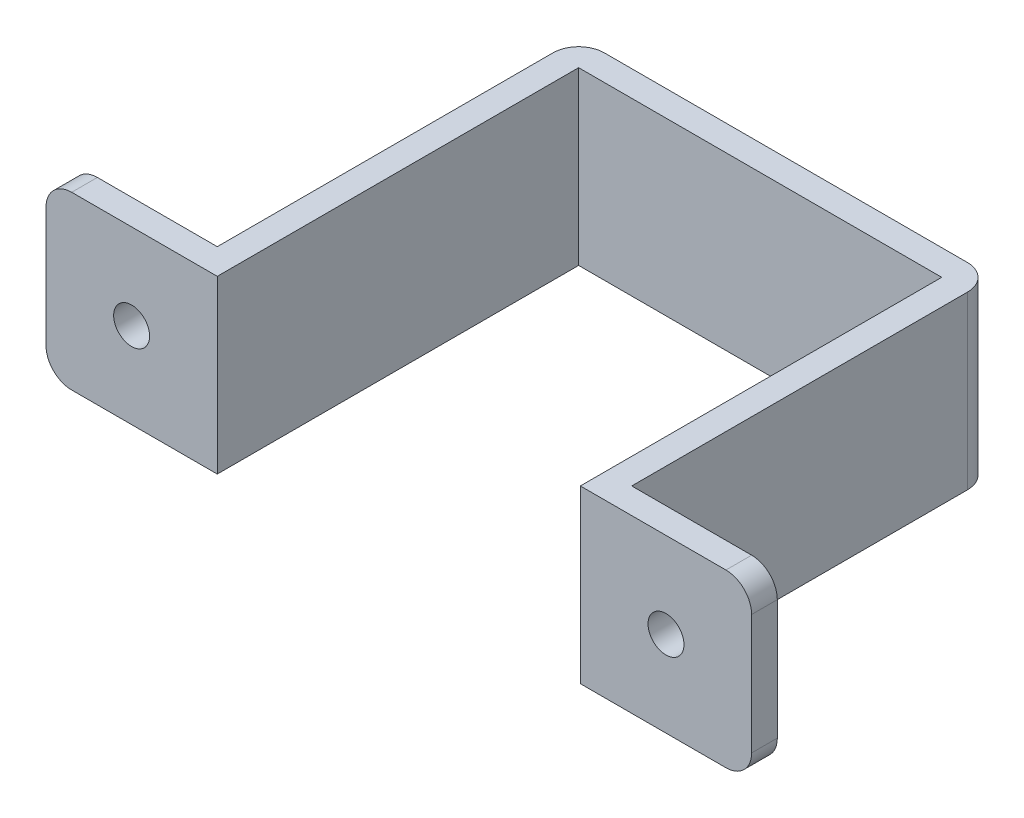
ISO-10303-21;
HEADER;
FILE_DESCRIPTION(('STEP AP214'),'2;1');
FILE_NAME('part.step','',(''),(''),'','','');
FILE_SCHEMA(('AUTOMOTIVE_DESIGN { 1 0 10303 214 1 1 1 1 }'));
ENDSEC;
DATA;
#1=APPLICATION_CONTEXT('core data for automotive mechanical design processes');
#2=APPLICATION_PROTOCOL_DEFINITION('international standard','automotive_design',2000,#1);
#3=PRODUCT_CONTEXT('',#1,'mechanical');
#4=PRODUCT('Part','Part','',(#3));
#5=PRODUCT_RELATED_PRODUCT_CATEGORY('part','',(#4));
#6=PRODUCT_DEFINITION_FORMATION('','',#4);
#7=PRODUCT_DEFINITION_CONTEXT('part definition',#1,'design');
#8=PRODUCT_DEFINITION('design','',#6,#7);
#9=PRODUCT_DEFINITION_SHAPE('','',#8);
#10=(LENGTH_UNIT() NAMED_UNIT(*) SI_UNIT(.MILLI.,.METRE.));
#11=(NAMED_UNIT(*) PLANE_ANGLE_UNIT() SI_UNIT($,.RADIAN.));
#12=(NAMED_UNIT(*) SI_UNIT($,.STERADIAN.) SOLID_ANGLE_UNIT());
#13=UNCERTAINTY_MEASURE_WITH_UNIT(LENGTH_MEASURE(1.E-05),#10,'distance_accuracy_value','');
#14=(GEOMETRIC_REPRESENTATION_CONTEXT(3) GLOBAL_UNCERTAINTY_ASSIGNED_CONTEXT((#13)) GLOBAL_UNIT_ASSIGNED_CONTEXT((#10,
#11,#12)) REPRESENTATION_CONTEXT('',''));
#15=CARTESIAN_POINT('',(0.,0.,0.));
#16=DIRECTION('',(0.,0.,1.));
#17=DIRECTION('',(1.,0.,0.));
#18=AXIS2_PLACEMENT_3D('',#15,#16,#17);
#19=CARTESIAN_POINT('',(-24.2,20.,-45.2));
#20=DIRECTION('',(1.,0.,0.));
#21=DIRECTION('',(0.,0.,-1.));
#22=AXIS2_PLACEMENT_3D('',#19,#20,#21);
#23=PLANE('',#22);
#24=DIRECTION('',(0.,0.,1.));
#25=VECTOR('',#24,1.);
#26=CARTESIAN_POINT('',(-24.2,20.,-45.2));
#27=LINE('',#26,#25);
#28=CARTESIAN_POINT('',(-24.2,20.,-42.2));
#29=VERTEX_POINT('',#28);
#30=CARTESIAN_POINT('',(-24.2,20.,-3.));
#31=VERTEX_POINT('',#30);
#32=EDGE_CURVE('E169',#29,#31,#27,.T.);
#33=ORIENTED_EDGE('',*,*,#32,.F.);
#34=DIRECTION('',(0.,-1.,0.));
#35=VECTOR('',#34,1.);
#36=CARTESIAN_POINT('',(-24.2,0.,-42.2));
#37=LINE('',#36,#35);
#38=CARTESIAN_POINT('',(-24.2,0.,-42.2));
#39=VERTEX_POINT('',#38);
#40=EDGE_CURVE('E197',#29,#39,#37,.T.);
#41=ORIENTED_EDGE('',*,*,#40,.T.);
#42=DIRECTION('',(0.,0.,1.));
#43=VECTOR('',#42,1.);
#44=CARTESIAN_POINT('',(-24.2,0.,-45.2));
#45=LINE('',#44,#43);
#46=CARTESIAN_POINT('',(-24.2,0.,-3.));
#47=VERTEX_POINT('',#46);
#48=EDGE_CURVE('E195',#39,#47,#45,.T.);
#49=ORIENTED_EDGE('',*,*,#48,.T.);
#50=DIRECTION('',(0.,-1.,0.));
#51=VECTOR('',#50,1.);
#52=CARTESIAN_POINT('',(-24.2,20.,-3.));
#53=LINE('',#52,#51);
#54=EDGE_CURVE('E188',#31,#47,#53,.T.);
#55=ORIENTED_EDGE('',*,*,#54,.F.);
#56=EDGE_LOOP('',(#33,#41,#49,#55));
#57=FACE_BOUND('',#56,.T.);
#58=ADVANCED_FACE('F43',(#57),#23,.F.);
#59=CARTESIAN_POINT('',(-24.2,20.,-3.));
#60=DIRECTION('',(0.,0.,1.));
#61=DIRECTION('',(1.,0.,0.));
#62=AXIS2_PLACEMENT_3D('',#59,#60,#61);
#63=PLANE('',#62);
#64=CARTESIAN_POINT('',(-31.2,10.,-3.));
#65=DIRECTION('',(0.,0.,-1.));
#66=DIRECTION('',(-1.,0.,0.));
#67=AXIS2_PLACEMENT_3D('',#64,#65,#66);
#68=CIRCLE('',#67,2.1);
#69=CARTESIAN_POINT('',(-33.3,10.,-3.));
#70=VERTEX_POINT('',#69);
#71=EDGE_CURVE('E543',#70,#70,#68,.T.);
#72=ORIENTED_EDGE('',*,*,#71,.F.);
#73=EDGE_LOOP('',(#72));
#74=FACE_BOUND('',#73,.T.);
#75=DIRECTION('',(-1.,0.,0.));
#76=VECTOR('',#75,1.);
#77=CARTESIAN_POINT('',(-24.2,0.,-3.));
#78=LINE('',#77,#76);
#79=CARTESIAN_POINT('',(-38.2,0.,-3.));
#80=VERTEX_POINT('',#79);
#81=EDGE_CURVE('E307',#47,#80,#78,.T.);
#82=ORIENTED_EDGE('',*,*,#81,.T.);
#83=CARTESIAN_POINT('',(-38.2,3.,-3.));
#84=DIRECTION('',(0.,0.,1.));
#85=DIRECTION('',(1.,0.,0.));
#86=AXIS2_PLACEMENT_3D('',#83,#84,#85);
#87=CIRCLE('',#86,3.);
#88=CARTESIAN_POINT('',(-41.2,3.,-3.));
#89=VERTEX_POINT('',#88);
#90=EDGE_CURVE('E235',#80,#89,#87,.F.);
#91=ORIENTED_EDGE('',*,*,#90,.T.);
#92=DIRECTION('',(0.,-1.,0.));
#93=VECTOR('',#92,1.);
#94=CARTESIAN_POINT('',(-41.2,20.,-3.));
#95=LINE('',#94,#93);
#96=CARTESIAN_POINT('',(-41.2,17.,-3.));
#97=VERTEX_POINT('',#96);
#98=EDGE_CURVE('E198',#97,#89,#95,.T.);
#99=ORIENTED_EDGE('',*,*,#98,.F.);
#100=CARTESIAN_POINT('',(-38.2,17.,-3.));
#101=DIRECTION('',(0.,0.,1.));
#102=DIRECTION('',(1.,0.,0.));
#103=AXIS2_PLACEMENT_3D('',#100,#101,#102);
#104=CIRCLE('',#103,3.);
#105=CARTESIAN_POINT('',(-38.2,20.,-3.));
#106=VERTEX_POINT('',#105);
#107=EDGE_CURVE('E191',#97,#106,#104,.F.);
#108=ORIENTED_EDGE('',*,*,#107,.T.);
#109=DIRECTION('',(-1.,0.,0.));
#110=VECTOR('',#109,1.);
#111=CARTESIAN_POINT('',(-24.2,20.,-3.));
#112=LINE('',#111,#110);
#113=EDGE_CURVE('E173',#31,#106,#112,.T.);
#114=ORIENTED_EDGE('',*,*,#113,.F.);
#115=ORIENTED_EDGE('',*,*,#54,.T.);
#116=EDGE_LOOP('',(#82,#91,#99,#108,#114,#115));
#117=FACE_BOUND('',#116,.T.);
#118=ADVANCED_FACE('F187',(#74,#117),#63,.F.);
#119=CARTESIAN_POINT('',(-41.2,20.,-3.));
#120=DIRECTION('',(1.,0.,0.));
#121=DIRECTION('',(0.,0.,-1.));
#122=AXIS2_PLACEMENT_3D('',#119,#120,#121);
#123=PLANE('',#122);
#124=ORIENTED_EDGE('',*,*,#98,.T.);
#125=DIRECTION('',(0.,0.,1.));
#126=VECTOR('',#125,1.);
#127=CARTESIAN_POINT('',(-41.2,3.,0.));
#128=LINE('',#127,#126);
#129=CARTESIAN_POINT('',(-41.2,3.,0.));
#130=VERTEX_POINT('',#129);
#131=EDGE_CURVE('E222',#89,#130,#128,.T.);
#132=ORIENTED_EDGE('',*,*,#131,.T.);
#133=DIRECTION('',(0.,-1.,0.));
#134=VECTOR('',#133,1.);
#135=CARTESIAN_POINT('',(-41.2,20.,0.));
#136=LINE('',#135,#134);
#137=CARTESIAN_POINT('',(-41.2,17.,0.));
#138=VERTEX_POINT('',#137);
#139=EDGE_CURVE('E203',#138,#130,#136,.T.);
#140=ORIENTED_EDGE('',*,*,#139,.F.);
#141=DIRECTION('',(0.,0.,1.));
#142=VECTOR('',#141,1.);
#143=CARTESIAN_POINT('',(-41.2,17.,-3.));
#144=LINE('',#143,#142);
#145=EDGE_CURVE('E220',#138,#97,#144,.F.);
#146=ORIENTED_EDGE('',*,*,#145,.T.);
#147=EDGE_LOOP('',(#124,#132,#140,#146));
#148=FACE_BOUND('',#147,.T.);
#149=ADVANCED_FACE('F282',(#148),#123,.F.);
#150=CARTESIAN_POINT('',(-41.2,20.,0.));
#151=DIRECTION('',(0.,0.,-1.));
#152=DIRECTION('',(-1.,0.,0.));
#153=AXIS2_PLACEMENT_3D('',#150,#151,#152);
#154=PLANE('',#153);
#155=CARTESIAN_POINT('',(-31.2,10.,0.));
#156=DIRECTION('',(0.,0.,-1.));
#157=DIRECTION('',(-1.,0.,0.));
#158=AXIS2_PLACEMENT_3D('',#155,#156,#157);
#159=CIRCLE('',#158,2.1);
#160=CARTESIAN_POINT('',(-33.3,10.,0.));
#161=VERTEX_POINT('',#160);
#162=EDGE_CURVE('E47',#161,#161,#159,.T.);
#163=ORIENTED_EDGE('',*,*,#162,.T.);
#164=EDGE_LOOP('',(#163));
#165=FACE_BOUND('',#164,.T.);
#166=ORIENTED_EDGE('',*,*,#139,.T.);
#167=CARTESIAN_POINT('',(-38.2,3.,0.));
#168=DIRECTION('',(0.,0.,-1.));
#169=DIRECTION('',(-1.,0.,0.));
#170=AXIS2_PLACEMENT_3D('',#167,#168,#169);
#171=CIRCLE('',#170,3.);
#172=CARTESIAN_POINT('',(-38.2,0.,0.));
#173=VERTEX_POINT('',#172);
#174=EDGE_CURVE('E227',#130,#173,#171,.F.);
#175=ORIENTED_EDGE('',*,*,#174,.T.);
#176=DIRECTION('',(1.,0.,0.));
#177=VECTOR('',#176,1.);
#178=CARTESIAN_POINT('',(-41.2,0.,0.));
#179=LINE('',#178,#177);
#180=CARTESIAN_POINT('',(-21.2,0.,0.));
#181=VERTEX_POINT('',#180);
#182=EDGE_CURVE('E309',#173,#181,#179,.T.);
#183=ORIENTED_EDGE('',*,*,#182,.T.);
#184=DIRECTION('',(0.,-1.,0.));
#185=VECTOR('',#184,1.);
#186=CARTESIAN_POINT('',(-21.2,20.,0.));
#187=LINE('',#186,#185);
#188=CARTESIAN_POINT('',(-21.2,20.,0.));
#189=VERTEX_POINT('',#188);
#190=EDGE_CURVE('E272',#189,#181,#187,.T.);
#191=ORIENTED_EDGE('',*,*,#190,.F.);
#192=DIRECTION('',(1.,0.,0.));
#193=VECTOR('',#192,1.);
#194=CARTESIAN_POINT('',(-41.2,20.,0.));
#195=LINE('',#194,#193);
#196=CARTESIAN_POINT('',(-38.2,20.,0.));
#197=VERTEX_POINT('',#196);
#198=EDGE_CURVE('E192',#197,#189,#195,.T.);
#199=ORIENTED_EDGE('',*,*,#198,.F.);
#200=CARTESIAN_POINT('',(-38.2,17.,0.));
#201=DIRECTION('',(0.,0.,-1.));
#202=DIRECTION('',(-1.,0.,0.));
#203=AXIS2_PLACEMENT_3D('',#200,#201,#202);
#204=CIRCLE('',#203,3.);
#205=EDGE_CURVE('E225',#197,#138,#204,.F.);
#206=ORIENTED_EDGE('',*,*,#205,.T.);
#207=EDGE_LOOP('',(#166,#175,#183,#191,#199,#206));
#208=FACE_BOUND('',#207,.T.);
#209=ADVANCED_FACE('F277',(#165,#208),#154,.F.);
#210=CARTESIAN_POINT('',(-21.2,20.,-42.2));
#211=DIRECTION('',(1.,0.,0.));
#212=DIRECTION('',(0.,0.,-1.));
#213=AXIS2_PLACEMENT_3D('',#210,#211,#212);
#214=PLANE('',#213);
#215=DIRECTION('',(0.,0.,1.));
#216=VECTOR('',#215,1.);
#217=CARTESIAN_POINT('',(-21.2,0.,-42.2));
#218=LINE('',#217,#216);
#219=CARTESIAN_POINT('',(-21.2,0.,-42.2));
#220=VERTEX_POINT('',#219);
#221=EDGE_CURVE('E311',#220,#181,#218,.T.);
#222=ORIENTED_EDGE('',*,*,#221,.F.);
#223=DIRECTION('',(0.,-1.,0.));
#224=VECTOR('',#223,1.);
#225=CARTESIAN_POINT('',(-21.2,20.,-42.2));
#226=LINE('',#225,#224);
#227=CARTESIAN_POINT('',(-21.2,20.,-42.2));
#228=VERTEX_POINT('',#227);
#229=EDGE_CURVE('E270',#228,#220,#226,.T.);
#230=ORIENTED_EDGE('',*,*,#229,.F.);
#231=DIRECTION('',(0.,0.,1.));
#232=VECTOR('',#231,1.);
#233=CARTESIAN_POINT('',(-21.2,20.,-6.01326965521406));
#234=LINE('',#233,#232);
#235=EDGE_CURVE('E288',#228,#189,#234,.T.);
#236=ORIENTED_EDGE('',*,*,#235,.T.);
#237=ORIENTED_EDGE('',*,*,#190,.T.);
#238=EDGE_LOOP('',(#222,#230,#236,#237));
#239=FACE_BOUND('',#238,.T.);
#240=ADVANCED_FACE('F379',(#239),#214,.T.);
#241=CARTESIAN_POINT('',(-21.2,20.,-42.2));
#242=DIRECTION('',(0.,0.,-1.));
#243=DIRECTION('',(-1.,0.,0.));
#244=AXIS2_PLACEMENT_3D('',#241,#242,#243);
#245=PLANE('',#244);
#246=DIRECTION('',(1.,0.,0.));
#247=VECTOR('',#246,1.);
#248=CARTESIAN_POINT('',(-21.2,0.,-42.2));
#249=LINE('',#248,#247);
#250=CARTESIAN_POINT('',(21.2,0.,-42.2));
#251=VERTEX_POINT('',#250);
#252=EDGE_CURVE('E314',#220,#251,#249,.T.);
#253=ORIENTED_EDGE('',*,*,#252,.T.);
#254=DIRECTION('',(0.,-1.,0.));
#255=VECTOR('',#254,1.);
#256=CARTESIAN_POINT('',(21.2,20.,-42.2));
#257=LINE('',#256,#255);
#258=CARTESIAN_POINT('',(21.2,20.,-42.2));
#259=VERTEX_POINT('',#258);
#260=EDGE_CURVE('E262',#259,#251,#257,.T.);
#261=ORIENTED_EDGE('',*,*,#260,.F.);
#262=DIRECTION('',(1.,0.,0.));
#263=VECTOR('',#262,1.);
#264=CARTESIAN_POINT('',(-21.2,20.,-42.2));
#265=LINE('',#264,#263);
#266=EDGE_CURVE('E290',#228,#259,#265,.T.);
#267=ORIENTED_EDGE('',*,*,#266,.F.);
#268=ORIENTED_EDGE('',*,*,#229,.T.);
#269=EDGE_LOOP('',(#253,#261,#267,#268));
#270=FACE_BOUND('',#269,.T.);
#271=ADVANCED_FACE('F385',(#270),#245,.F.);
#272=CARTESIAN_POINT('',(21.2,20.,-6.01326965521406));
#273=DIRECTION('',(1.,0.,0.));
#274=DIRECTION('',(0.,0.,-1.));
#275=AXIS2_PLACEMENT_3D('',#272,#273,#274);
#276=PLANE('',#275);
#277=DIRECTION('',(0.,0.,1.));
#278=VECTOR('',#277,1.);
#279=CARTESIAN_POINT('',(21.2,0.,-6.01326965521406));
#280=LINE('',#279,#278);
#281=CARTESIAN_POINT('',(21.2,0.,0.));
#282=VERTEX_POINT('',#281);
#283=EDGE_CURVE('E317',#251,#282,#280,.T.);
#284=ORIENTED_EDGE('',*,*,#283,.T.);
#285=DIRECTION('',(0.,-1.,0.));
#286=VECTOR('',#285,1.);
#287=CARTESIAN_POINT('',(21.2,20.,0.));
#288=LINE('',#287,#286);
#289=CARTESIAN_POINT('',(21.2,20.,0.));
#290=VERTEX_POINT('',#289);
#291=EDGE_CURVE('E259',#290,#282,#288,.T.);
#292=ORIENTED_EDGE('',*,*,#291,.F.);
#293=DIRECTION('',(0.,0.,1.));
#294=VECTOR('',#293,1.);
#295=CARTESIAN_POINT('',(21.2,20.,-42.2));
#296=LINE('',#295,#294);
#297=EDGE_CURVE('E294',#259,#290,#296,.T.);
#298=ORIENTED_EDGE('',*,*,#297,.F.);
#299=ORIENTED_EDGE('',*,*,#260,.T.);
#300=EDGE_LOOP('',(#284,#292,#298,#299));
#301=FACE_BOUND('',#300,.T.);
#302=ADVANCED_FACE('F387',(#301),#276,.F.);
#303=CARTESIAN_POINT('',(41.2,20.,0.));
#304=DIRECTION('',(0.,0.,1.));
#305=DIRECTION('',(1.,0.,0.));
#306=AXIS2_PLACEMENT_3D('',#303,#304,#305);
#307=PLANE('',#306);
#308=CARTESIAN_POINT('',(31.2,10.,0.));
#309=DIRECTION('',(0.,0.,1.));
#310=DIRECTION('',(1.,0.,0.));
#311=AXIS2_PLACEMENT_3D('',#308,#309,#310);
#312=CIRCLE('',#311,2.1);
#313=CARTESIAN_POINT('',(33.3,10.,0.));
#314=VERTEX_POINT('',#313);
#315=EDGE_CURVE('E546',#314,#314,#312,.T.);
#316=ORIENTED_EDGE('',*,*,#315,.F.);
#317=EDGE_LOOP('',(#316));
#318=FACE_BOUND('',#317,.T.);
#319=DIRECTION('',(-1.,0.,0.));
#320=VECTOR('',#319,1.);
#321=CARTESIAN_POINT('',(41.2,0.,0.));
#322=LINE('',#321,#320);
#323=CARTESIAN_POINT('',(38.2,0.,0.));
#324=VERTEX_POINT('',#323);
#325=EDGE_CURVE('E320',#324,#282,#322,.T.);
#326=ORIENTED_EDGE('',*,*,#325,.F.);
#327=CARTESIAN_POINT('',(38.2,3.,0.));
#328=DIRECTION('',(0.,0.,1.));
#329=DIRECTION('',(1.,0.,0.));
#330=AXIS2_PLACEMENT_3D('',#327,#328,#329);
#331=CIRCLE('',#330,3.);
#332=CARTESIAN_POINT('',(41.2,3.,0.));
#333=VERTEX_POINT('',#332);
#334=EDGE_CURVE('E243',#324,#333,#331,.T.);
#335=ORIENTED_EDGE('',*,*,#334,.T.);
#336=DIRECTION('',(0.,-1.,0.));
#337=VECTOR('',#336,1.);
#338=CARTESIAN_POINT('',(41.2,20.,0.));
#339=LINE('',#338,#337);
#340=CARTESIAN_POINT('',(41.2,17.,0.));
#341=VERTEX_POINT('',#340);
#342=EDGE_CURVE('E252',#341,#333,#339,.T.);
#343=ORIENTED_EDGE('',*,*,#342,.F.);
#344=CARTESIAN_POINT('',(38.2,17.,0.));
#345=DIRECTION('',(0.,0.,1.));
#346=DIRECTION('',(1.,0.,0.));
#347=AXIS2_PLACEMENT_3D('',#344,#345,#346);
#348=CIRCLE('',#347,3.);
#349=CARTESIAN_POINT('',(38.2,20.,0.));
#350=VERTEX_POINT('',#349);
#351=EDGE_CURVE('E241',#341,#350,#348,.T.);
#352=ORIENTED_EDGE('',*,*,#351,.T.);
#353=DIRECTION('',(-1.,0.,0.));
#354=VECTOR('',#353,1.);
#355=CARTESIAN_POINT('',(41.2,20.,0.));
#356=LINE('',#355,#354);
#357=EDGE_CURVE('E297',#350,#290,#356,.T.);
#358=ORIENTED_EDGE('',*,*,#357,.T.);
#359=ORIENTED_EDGE('',*,*,#291,.T.);
#360=EDGE_LOOP('',(#326,#335,#343,#352,#358,#359));
#361=FACE_BOUND('',#360,.T.);
#362=ADVANCED_FACE('F257',(#318,#361),#307,.T.);
#363=CARTESIAN_POINT('',(41.2,20.,-3.));
#364=DIRECTION('',(1.,0.,0.));
#365=DIRECTION('',(0.,0.,-1.));
#366=AXIS2_PLACEMENT_3D('',#363,#364,#365);
#367=PLANE('',#366);
#368=ORIENTED_EDGE('',*,*,#342,.T.);
#369=DIRECTION('',(0.,0.,1.));
#370=VECTOR('',#369,1.);
#371=CARTESIAN_POINT('',(41.2,3.,-3.));
#372=LINE('',#371,#370);
#373=CARTESIAN_POINT('',(41.2,3.,-3.));
#374=VERTEX_POINT('',#373);
#375=EDGE_CURVE('E59',#333,#374,#372,.F.);
#376=ORIENTED_EDGE('',*,*,#375,.T.);
#377=DIRECTION('',(0.,-1.,0.));
#378=VECTOR('',#377,1.);
#379=CARTESIAN_POINT('',(41.2,20.,-3.));
#380=LINE('',#379,#378);
#381=CARTESIAN_POINT('',(41.2,17.,-3.));
#382=VERTEX_POINT('',#381);
#383=EDGE_CURVE('E253',#382,#374,#380,.T.);
#384=ORIENTED_EDGE('',*,*,#383,.F.);
#385=DIRECTION('',(0.,0.,1.));
#386=VECTOR('',#385,1.);
#387=CARTESIAN_POINT('',(41.2,17.,0.));
#388=LINE('',#387,#386);
#389=EDGE_CURVE('E245',#382,#341,#388,.T.);
#390=ORIENTED_EDGE('',*,*,#389,.T.);
#391=EDGE_LOOP('',(#368,#376,#384,#390));
#392=FACE_BOUND('',#391,.T.);
#393=ADVANCED_FACE('F251',(#392),#367,.T.);
#394=CARTESIAN_POINT('',(24.2,20.,-3.));
#395=DIRECTION('',(0.,0.,-1.));
#396=DIRECTION('',(-1.,0.,0.));
#397=AXIS2_PLACEMENT_3D('',#394,#395,#396);
#398=PLANE('',#397);
#399=CARTESIAN_POINT('',(31.2,10.,-3.));
#400=DIRECTION('',(0.,0.,-1.));
#401=DIRECTION('',(-1.,0.,0.));
#402=AXIS2_PLACEMENT_3D('',#399,#400,#401);
#403=CIRCLE('',#402,2.1);
#404=CARTESIAN_POINT('',(29.1,10.,-3.));
#405=VERTEX_POINT('',#404);
#406=EDGE_CURVE('E550',#405,#405,#403,.T.);
#407=ORIENTED_EDGE('',*,*,#406,.F.);
#408=EDGE_LOOP('',(#407));
#409=FACE_BOUND('',#408,.T.);
#410=ORIENTED_EDGE('',*,*,#383,.T.);
#411=CARTESIAN_POINT('',(38.2,3.,-3.));
#412=DIRECTION('',(0.,0.,-1.));
#413=DIRECTION('',(-1.,0.,0.));
#414=AXIS2_PLACEMENT_3D('',#411,#412,#413);
#415=CIRCLE('',#414,3.);
#416=CARTESIAN_POINT('',(38.2,0.,-3.));
#417=VERTEX_POINT('',#416);
#418=EDGE_CURVE('E11',#374,#417,#415,.T.);
#419=ORIENTED_EDGE('',*,*,#418,.T.);
#420=DIRECTION('',(1.,0.,0.));
#421=VECTOR('',#420,1.);
#422=CARTESIAN_POINT('',(24.2,0.,-3.));
#423=LINE('',#422,#421);
#424=CARTESIAN_POINT('',(24.2,0.,-3.));
#425=VERTEX_POINT('',#424);
#426=EDGE_CURVE('E322',#425,#417,#423,.T.);
#427=ORIENTED_EDGE('',*,*,#426,.F.);
#428=DIRECTION('',(0.,-1.,0.));
#429=VECTOR('',#428,1.);
#430=CARTESIAN_POINT('',(24.2,20.,-3.));
#431=LINE('',#430,#429);
#432=CARTESIAN_POINT('',(24.2,20.,-3.));
#433=VERTEX_POINT('',#432);
#434=EDGE_CURVE('E264',#433,#425,#431,.T.);
#435=ORIENTED_EDGE('',*,*,#434,.F.);
#436=DIRECTION('',(1.,0.,0.));
#437=VECTOR('',#436,1.);
#438=CARTESIAN_POINT('',(24.2,20.,-3.));
#439=LINE('',#438,#437);
#440=CARTESIAN_POINT('',(38.2,20.,-3.));
#441=VERTEX_POINT('',#440);
#442=EDGE_CURVE('E299',#433,#441,#439,.T.);
#443=ORIENTED_EDGE('',*,*,#442,.T.);
#444=CARTESIAN_POINT('',(38.2,17.,-3.));
#445=DIRECTION('',(0.,0.,-1.));
#446=DIRECTION('',(-1.,0.,0.));
#447=AXIS2_PLACEMENT_3D('',#444,#445,#446);
#448=CIRCLE('',#447,3.);
#449=EDGE_CURVE('E52',#441,#382,#448,.T.);
#450=ORIENTED_EDGE('',*,*,#449,.T.);
#451=EDGE_LOOP('',(#410,#419,#427,#435,#443,#450));
#452=FACE_BOUND('',#451,.T.);
#453=ADVANCED_FACE('F337',(#409,#452),#398,.T.);
#454=CARTESIAN_POINT('',(24.2,20.,-45.2));
#455=DIRECTION('',(1.,0.,0.));
#456=DIRECTION('',(0.,0.,-1.));
#457=AXIS2_PLACEMENT_3D('',#454,#455,#456);
#458=PLANE('',#457);
#459=DIRECTION('',(0.,0.,1.));
#460=VECTOR('',#459,1.);
#461=CARTESIAN_POINT('',(24.2,0.,-45.2));
#462=LINE('',#461,#460);
#463=CARTESIAN_POINT('',(24.2,0.,-42.2));
#464=VERTEX_POINT('',#463);
#465=EDGE_CURVE('E325',#464,#425,#462,.T.);
#466=ORIENTED_EDGE('',*,*,#465,.F.);
#467=DIRECTION('',(0.,-1.,0.));
#468=VECTOR('',#467,1.);
#469=CARTESIAN_POINT('',(24.2,20.,-42.2));
#470=LINE('',#469,#468);
#471=CARTESIAN_POINT('',(24.2,20.,-42.2));
#472=VERTEX_POINT('',#471);
#473=EDGE_CURVE('E218',#464,#472,#470,.F.);
#474=ORIENTED_EDGE('',*,*,#473,.T.);
#475=DIRECTION('',(0.,0.,1.));
#476=VECTOR('',#475,1.);
#477=CARTESIAN_POINT('',(24.2,20.,-45.2));
#478=LINE('',#477,#476);
#479=EDGE_CURVE('E301',#472,#433,#478,.T.);
#480=ORIENTED_EDGE('',*,*,#479,.T.);
#481=ORIENTED_EDGE('',*,*,#434,.T.);
#482=EDGE_LOOP('',(#466,#474,#480,#481));
#483=FACE_BOUND('',#482,.T.);
#484=ADVANCED_FACE('F333',(#483),#458,.T.);
#485=CARTESIAN_POINT('',(-24.2,20.,-45.2));
#486=DIRECTION('',(0.,0.,-1.));
#487=DIRECTION('',(-1.,0.,0.));
#488=AXIS2_PLACEMENT_3D('',#485,#486,#487);
#489=PLANE('',#488);
#490=DIRECTION('',(1.,0.,0.));
#491=VECTOR('',#490,1.);
#492=CARTESIAN_POINT('',(-24.2,0.,-45.2));
#493=LINE('',#492,#491);
#494=CARTESIAN_POINT('',(-21.2,0.,-45.2));
#495=VERTEX_POINT('',#494);
#496=CARTESIAN_POINT('',(21.2,0.,-45.2));
#497=VERTEX_POINT('',#496);
#498=EDGE_CURVE('E182',#495,#497,#493,.T.);
#499=ORIENTED_EDGE('',*,*,#498,.F.);
#500=DIRECTION('',(0.,-1.,0.));
#501=VECTOR('',#500,1.);
#502=CARTESIAN_POINT('',(-21.2,20.,-45.2));
#503=LINE('',#502,#501);
#504=CARTESIAN_POINT('',(-21.2,20.,-45.2));
#505=VERTEX_POINT('',#504);
#506=EDGE_CURVE('E213',#495,#505,#503,.F.);
#507=ORIENTED_EDGE('',*,*,#506,.T.);
#508=DIRECTION('',(1.,0.,0.));
#509=VECTOR('',#508,1.);
#510=CARTESIAN_POINT('',(-24.2,20.,-45.2));
#511=LINE('',#510,#509);
#512=CARTESIAN_POINT('',(21.2,20.,-45.2));
#513=VERTEX_POINT('',#512);
#514=EDGE_CURVE('E303',#505,#513,#511,.T.);
#515=ORIENTED_EDGE('',*,*,#514,.T.);
#516=DIRECTION('',(0.,-1.,0.));
#517=VECTOR('',#516,1.);
#518=CARTESIAN_POINT('',(21.2,20.,-45.2));
#519=LINE('',#518,#517);
#520=EDGE_CURVE('E210',#513,#497,#519,.T.);
#521=ORIENTED_EDGE('',*,*,#520,.T.);
#522=EDGE_LOOP('',(#499,#507,#515,#521));
#523=FACE_BOUND('',#522,.T.);
#524=ADVANCED_FACE('F393',(#523),#489,.T.);
#525=CARTESIAN_POINT('',(0.,20.,0.));
#526=DIRECTION('',(0.,-1.,0.));
#527=DIRECTION('',(0.,0.,-1.));
#528=AXIS2_PLACEMENT_3D('',#525,#526,#527);
#529=PLANE('',#528);
#530=ORIENTED_EDGE('',*,*,#113,.T.);
#531=DIRECTION('',(0.,0.,1.));
#532=VECTOR('',#531,1.);
#533=CARTESIAN_POINT('',(-38.2,20.,0.));
#534=LINE('',#533,#532);
#535=EDGE_CURVE('E239',#106,#197,#534,.T.);
#536=ORIENTED_EDGE('',*,*,#535,.T.);
#537=ORIENTED_EDGE('',*,*,#198,.T.);
#538=ORIENTED_EDGE('',*,*,#235,.F.);
#539=ORIENTED_EDGE('',*,*,#266,.T.);
#540=ORIENTED_EDGE('',*,*,#297,.T.);
#541=ORIENTED_EDGE('',*,*,#357,.F.);
#542=DIRECTION('',(0.,0.,1.));
#543=VECTOR('',#542,1.);
#544=CARTESIAN_POINT('',(38.2,20.,-3.));
#545=LINE('',#544,#543);
#546=EDGE_CURVE('E237',#350,#441,#545,.F.);
#547=ORIENTED_EDGE('',*,*,#546,.T.);
#548=ORIENTED_EDGE('',*,*,#442,.F.);
#549=ORIENTED_EDGE('',*,*,#479,.F.);
#550=CARTESIAN_POINT('',(21.2,20.,-42.2));
#551=DIRECTION('',(0.,-1.,0.));
#552=DIRECTION('',(0.,0.,-1.));
#553=AXIS2_PLACEMENT_3D('',#550,#551,#552);
#554=CIRCLE('',#553,3.);
#555=EDGE_CURVE('E215',#472,#513,#554,.F.);
#556=ORIENTED_EDGE('',*,*,#555,.T.);
#557=ORIENTED_EDGE('',*,*,#514,.F.);
#558=CARTESIAN_POINT('',(-21.2,20.,-42.2));
#559=DIRECTION('',(0.,-1.,0.));
#560=DIRECTION('',(0.,0.,-1.));
#561=AXIS2_PLACEMENT_3D('',#558,#559,#560);
#562=CIRCLE('',#561,3.);
#563=EDGE_CURVE('E177',#505,#29,#562,.F.);
#564=ORIENTED_EDGE('',*,*,#563,.T.);
#565=ORIENTED_EDGE('',*,*,#32,.T.);
#566=EDGE_LOOP('',(#530,#536,#537,#538,#539,#540,#541,#547,#548,#549,#556,#557,#564,#565));
#567=FACE_BOUND('',#566,.T.);
#568=ADVANCED_FACE('F171',(#567),#529,.F.);
#569=CARTESIAN_POINT('',(0.,0.,0.));
#570=DIRECTION('',(0.,-1.,0.));
#571=DIRECTION('',(0.,0.,-1.));
#572=AXIS2_PLACEMENT_3D('',#569,#570,#571);
#573=PLANE('',#572);
#574=ORIENTED_EDGE('',*,*,#182,.F.);
#575=DIRECTION('',(0.,0.,1.));
#576=VECTOR('',#575,1.);
#577=CARTESIAN_POINT('',(-38.2,0.,-3.));
#578=LINE('',#577,#576);
#579=EDGE_CURVE('E232',#173,#80,#578,.F.);
#580=ORIENTED_EDGE('',*,*,#579,.T.);
#581=ORIENTED_EDGE('',*,*,#81,.F.);
#582=ORIENTED_EDGE('',*,*,#48,.F.);
#583=CARTESIAN_POINT('',(-21.2,0.,-42.2));
#584=DIRECTION('',(0.,-1.,0.));
#585=DIRECTION('',(0.,0.,-1.));
#586=AXIS2_PLACEMENT_3D('',#583,#584,#585);
#587=CIRCLE('',#586,3.);
#588=EDGE_CURVE('E208',#39,#495,#587,.T.);
#589=ORIENTED_EDGE('',*,*,#588,.T.);
#590=ORIENTED_EDGE('',*,*,#498,.T.);
#591=CARTESIAN_POINT('',(21.2,0.,-42.2));
#592=DIRECTION('',(0.,-1.,0.));
#593=DIRECTION('',(0.,0.,-1.));
#594=AXIS2_PLACEMENT_3D('',#591,#592,#593);
#595=CIRCLE('',#594,3.);
#596=EDGE_CURVE('E200',#497,#464,#595,.T.);
#597=ORIENTED_EDGE('',*,*,#596,.T.);
#598=ORIENTED_EDGE('',*,*,#465,.T.);
#599=ORIENTED_EDGE('',*,*,#426,.T.);
#600=DIRECTION('',(0.,0.,1.));
#601=VECTOR('',#600,1.);
#602=CARTESIAN_POINT('',(38.2,0.,0.));
#603=LINE('',#602,#601);
#604=EDGE_CURVE('E229',#417,#324,#603,.T.);
#605=ORIENTED_EDGE('',*,*,#604,.T.);
#606=ORIENTED_EDGE('',*,*,#325,.T.);
#607=ORIENTED_EDGE('',*,*,#283,.F.);
#608=ORIENTED_EDGE('',*,*,#252,.F.);
#609=ORIENTED_EDGE('',*,*,#221,.T.);
#610=EDGE_LOOP('',(#574,#580,#581,#582,#589,#590,#597,#598,#599,#605,#606,#607,#608,#609));
#611=FACE_BOUND('',#610,.T.);
#612=ADVANCED_FACE('F341',(#611),#573,.T.);
#613=CARTESIAN_POINT('',(-21.2,20.,-42.2));
#614=DIRECTION('',(0.,1.,0.));
#615=DIRECTION('',(0.,0.,1.));
#616=AXIS2_PLACEMENT_3D('',#613,#614,#615);
#617=CYLINDRICAL_SURFACE('',#616,3.);
#618=ORIENTED_EDGE('',*,*,#563,.F.);
#619=ORIENTED_EDGE('',*,*,#506,.F.);
#620=ORIENTED_EDGE('',*,*,#588,.F.);
#621=ORIENTED_EDGE('',*,*,#40,.F.);
#622=EDGE_LOOP('',(#618,#619,#620,#621));
#623=FACE_BOUND('',#622,.T.);
#624=ADVANCED_FACE('F361',(#623),#617,.T.);
#625=CARTESIAN_POINT('',(21.2,20.,-42.2));
#626=DIRECTION('',(0.,-1.,0.));
#627=DIRECTION('',(0.,0.,-1.));
#628=AXIS2_PLACEMENT_3D('',#625,#626,#627);
#629=CYLINDRICAL_SURFACE('',#628,3.);
#630=ORIENTED_EDGE('',*,*,#555,.F.);
#631=ORIENTED_EDGE('',*,*,#473,.F.);
#632=ORIENTED_EDGE('',*,*,#596,.F.);
#633=ORIENTED_EDGE('',*,*,#520,.F.);
#634=EDGE_LOOP('',(#630,#631,#632,#633));
#635=FACE_BOUND('',#634,.T.);
#636=ADVANCED_FACE('F364',(#635),#629,.T.);
#637=CARTESIAN_POINT('',(-38.2,3.,-3.));
#638=DIRECTION('',(0.,0.,-1.));
#639=DIRECTION('',(-1.,0.,0.));
#640=AXIS2_PLACEMENT_3D('',#637,#638,#639);
#641=CYLINDRICAL_SURFACE('',#640,3.);
#642=ORIENTED_EDGE('',*,*,#90,.F.);
#643=ORIENTED_EDGE('',*,*,#579,.F.);
#644=ORIENTED_EDGE('',*,*,#174,.F.);
#645=ORIENTED_EDGE('',*,*,#131,.F.);
#646=EDGE_LOOP('',(#642,#643,#644,#645));
#647=FACE_BOUND('',#646,.T.);
#648=ADVANCED_FACE('F350',(#647),#641,.T.);
#649=CARTESIAN_POINT('',(-38.2,17.,0.));
#650=DIRECTION('',(0.,0.,1.));
#651=DIRECTION('',(1.,0.,0.));
#652=AXIS2_PLACEMENT_3D('',#649,#650,#651);
#653=CYLINDRICAL_SURFACE('',#652,3.);
#654=ORIENTED_EDGE('',*,*,#107,.F.);
#655=ORIENTED_EDGE('',*,*,#145,.F.);
#656=ORIENTED_EDGE('',*,*,#205,.F.);
#657=ORIENTED_EDGE('',*,*,#535,.F.);
#658=EDGE_LOOP('',(#654,#655,#656,#657));
#659=FACE_BOUND('',#658,.T.);
#660=ADVANCED_FACE('F285',(#659),#653,.T.);
#661=CARTESIAN_POINT('',(38.2,3.,0.));
#662=DIRECTION('',(0.,0.,1.));
#663=DIRECTION('',(1.,0.,0.));
#664=AXIS2_PLACEMENT_3D('',#661,#662,#663);
#665=CYLINDRICAL_SURFACE('',#664,3.);
#666=ORIENTED_EDGE('',*,*,#418,.F.);
#667=ORIENTED_EDGE('',*,*,#375,.F.);
#668=ORIENTED_EDGE('',*,*,#334,.F.);
#669=ORIENTED_EDGE('',*,*,#604,.F.);
#670=EDGE_LOOP('',(#666,#667,#668,#669));
#671=FACE_BOUND('',#670,.T.);
#672=ADVANCED_FACE('F343',(#671),#665,.T.);
#673=CARTESIAN_POINT('',(38.2,17.,-3.));
#674=DIRECTION('',(0.,0.,-1.));
#675=DIRECTION('',(-1.,0.,0.));
#676=AXIS2_PLACEMENT_3D('',#673,#674,#675);
#677=CYLINDRICAL_SURFACE('',#676,3.);
#678=ORIENTED_EDGE('',*,*,#449,.F.);
#679=ORIENTED_EDGE('',*,*,#546,.F.);
#680=ORIENTED_EDGE('',*,*,#351,.F.);
#681=ORIENTED_EDGE('',*,*,#389,.F.);
#682=EDGE_LOOP('',(#678,#679,#680,#681));
#683=FACE_BOUND('',#682,.T.);
#684=ADVANCED_FACE('F45',(#683),#677,.T.);
#685=CARTESIAN_POINT('',(31.2,10.,7.));
#686=DIRECTION('',(0.,0.,-1.));
#687=DIRECTION('',(-1.,0.,0.));
#688=AXIS2_PLACEMENT_3D('',#685,#686,#687);
#689=CYLINDRICAL_SURFACE('',#688,2.1);
#690=ORIENTED_EDGE('',*,*,#315,.T.);
#691=EDGE_LOOP('',(#690));
#692=FACE_BOUND('',#691,.T.);
#693=ORIENTED_EDGE('',*,*,#406,.T.);
#694=EDGE_LOOP('',(#693));
#695=FACE_BOUND('',#694,.T.);
#696=ADVANCED_FACE('F349',(#692,#695),#689,.F.);
#697=CARTESIAN_POINT('',(-31.2,10.,7.));
#698=DIRECTION('',(0.,0.,-1.));
#699=DIRECTION('',(-1.,0.,0.));
#700=AXIS2_PLACEMENT_3D('',#697,#698,#699);
#701=CYLINDRICAL_SURFACE('',#700,2.1);
#702=ORIENTED_EDGE('',*,*,#71,.T.);
#703=EDGE_LOOP('',(#702));
#704=FACE_BOUND('',#703,.T.);
#705=ORIENTED_EDGE('',*,*,#162,.F.);
#706=EDGE_LOOP('',(#705));
#707=FACE_BOUND('',#706,.T.);
#708=ADVANCED_FACE('F523',(#704,#707),#701,.F.);
#709=CLOSED_SHELL('',(#58,#118,#149,#209,#240,#271,#302,#362,#393,#453,#484,#524,#568,#612,#624,
#636,#648,#660,#672,#684,#696,#708));
#710=MANIFOLD_SOLID_BREP('B2',#709);
#711=ADVANCED_BREP_SHAPE_REPRESENTATION('',(#18,#710),#14);
#712=SHAPE_DEFINITION_REPRESENTATION(#9,#711);
ENDSEC;
END-ISO-10303-21;
